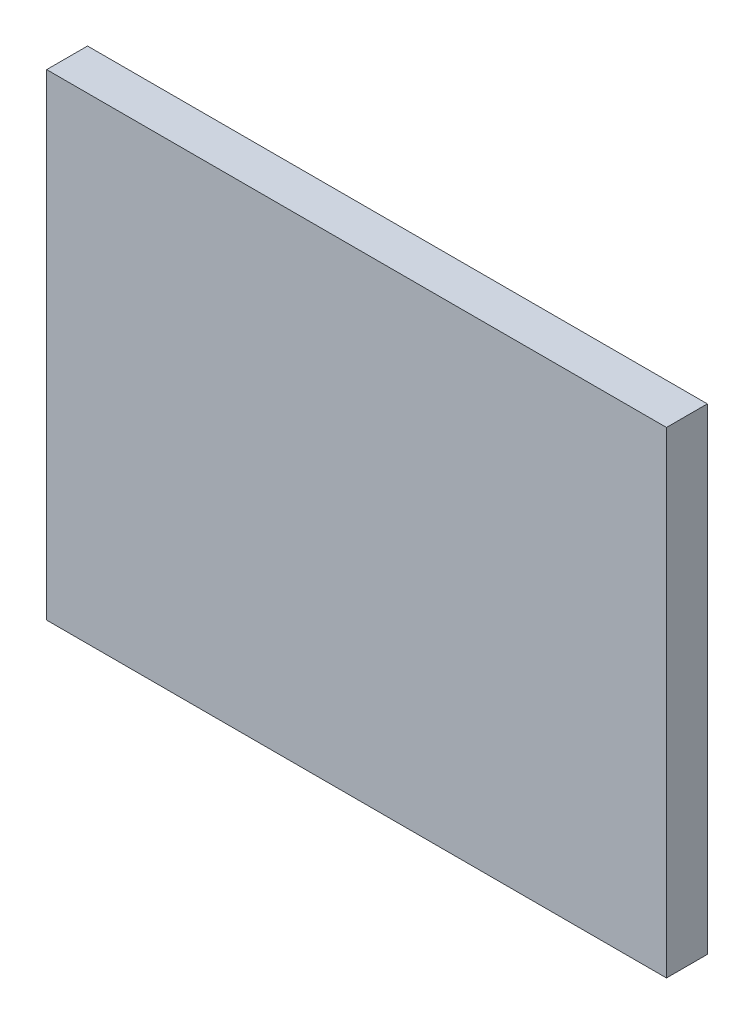
ISO-10303-21;
HEADER;
FILE_DESCRIPTION(('STEP AP214'),'2;1');
FILE_NAME('part.step','',(''),(''),'','','');
FILE_SCHEMA(('AUTOMOTIVE_DESIGN { 1 0 10303 214 1 1 1 1 }'));
ENDSEC;
DATA;
#1=APPLICATION_CONTEXT('core data for automotive mechanical design processes');
#2=APPLICATION_PROTOCOL_DEFINITION('international standard','automotive_design',2000,#1);
#3=PRODUCT_CONTEXT('',#1,'mechanical');
#4=PRODUCT('Part','Part','',(#3));
#5=PRODUCT_RELATED_PRODUCT_CATEGORY('part','',(#4));
#6=PRODUCT_DEFINITION_FORMATION('','',#4);
#7=PRODUCT_DEFINITION_CONTEXT('part definition',#1,'design');
#8=PRODUCT_DEFINITION('design','',#6,#7);
#9=PRODUCT_DEFINITION_SHAPE('','',#8);
#10=(LENGTH_UNIT() NAMED_UNIT(*) SI_UNIT(.MILLI.,.METRE.));
#11=(NAMED_UNIT(*) PLANE_ANGLE_UNIT() SI_UNIT($,.RADIAN.));
#12=(NAMED_UNIT(*) SI_UNIT($,.STERADIAN.) SOLID_ANGLE_UNIT());
#13=UNCERTAINTY_MEASURE_WITH_UNIT(LENGTH_MEASURE(1.E-05),#10,'distance_accuracy_value','');
#14=(GEOMETRIC_REPRESENTATION_CONTEXT(3) GLOBAL_UNCERTAINTY_ASSIGNED_CONTEXT((#13)) GLOBAL_UNIT_ASSIGNED_CONTEXT((#10,
#11,#12)) REPRESENTATION_CONTEXT('',''));
#15=CARTESIAN_POINT('',(0.,0.,0.));
#16=DIRECTION('',(0.,0.,1.));
#17=DIRECTION('',(1.,0.,0.));
#18=AXIS2_PLACEMENT_3D('',#15,#16,#17);
#19=CARTESIAN_POINT('',(45.4999999999999,70.,3.));
#20=DIRECTION('',(-1.,0.,0.));
#21=DIRECTION('',(0.,0.,1.));
#22=AXIS2_PLACEMENT_3D('',#19,#20,#21);
#23=PLANE('',#22);
#24=DIRECTION('',(0.,0.,-1.));
#25=VECTOR('',#24,1.);
#26=CARTESIAN_POINT('',(45.4999999999999,0.,3.));
#27=LINE('',#26,#25);
#28=CARTESIAN_POINT('',(45.4999999999999,0.,3.));
#29=VERTEX_POINT('',#28);
#30=CARTESIAN_POINT('',(45.4999999999999,0.,-3.));
#31=VERTEX_POINT('',#30);
#32=EDGE_CURVE('E96',#29,#31,#27,.T.);
#33=ORIENTED_EDGE('',*,*,#32,.T.);
#34=DIRECTION('',(0.,-1.,0.));
#35=VECTOR('',#34,1.);
#36=CARTESIAN_POINT('',(45.4999999999999,70.,-3.));
#37=LINE('',#36,#35);
#38=CARTESIAN_POINT('',(45.4999999999999,70.,-3.));
#39=VERTEX_POINT('',#38);
#40=EDGE_CURVE('E11',#39,#31,#37,.T.);
#41=ORIENTED_EDGE('',*,*,#40,.F.);
#42=DIRECTION('',(0.,0.,-1.));
#43=VECTOR('',#42,1.);
#44=CARTESIAN_POINT('',(45.4999999999999,70.,3.));
#45=LINE('',#44,#43);
#46=CARTESIAN_POINT('',(45.4999999999999,70.,3.));
#47=VERTEX_POINT('',#46);
#48=EDGE_CURVE('E84',#47,#39,#45,.T.);
#49=ORIENTED_EDGE('',*,*,#48,.F.);
#50=DIRECTION('',(0.,-1.,0.));
#51=VECTOR('',#50,1.);
#52=CARTESIAN_POINT('',(45.4999999999999,70.,3.));
#53=LINE('',#52,#51);
#54=EDGE_CURVE('E92',#47,#29,#53,.T.);
#55=ORIENTED_EDGE('',*,*,#54,.T.);
#56=EDGE_LOOP('',(#33,#41,#49,#55));
#57=FACE_BOUND('',#56,.T.);
#58=ADVANCED_FACE('F33',(#57),#23,.F.);
#59=CARTESIAN_POINT('',(-45.5000000000001,70.,-3.));
#60=DIRECTION('',(0.,0.,1.));
#61=DIRECTION('',(1.,0.,0.));
#62=AXIS2_PLACEMENT_3D('',#59,#60,#61);
#63=PLANE('',#62);
#64=DIRECTION('',(-1.,0.,0.));
#65=VECTOR('',#64,1.);
#66=CARTESIAN_POINT('',(-45.5000000000001,0.,-3.));
#67=LINE('',#66,#65);
#68=CARTESIAN_POINT('',(-45.5000000000001,0.,-3.));
#69=VERTEX_POINT('',#68);
#70=EDGE_CURVE('E88',#31,#69,#67,.T.);
#71=ORIENTED_EDGE('',*,*,#70,.T.);
#72=DIRECTION('',(0.,-1.,0.));
#73=VECTOR('',#72,1.);
#74=CARTESIAN_POINT('',(-45.5000000000001,70.,-3.));
#75=LINE('',#74,#73);
#76=CARTESIAN_POINT('',(-45.5000000000001,70.,-3.));
#77=VERTEX_POINT('',#76);
#78=EDGE_CURVE('E41',#77,#69,#75,.T.);
#79=ORIENTED_EDGE('',*,*,#78,.F.);
#80=DIRECTION('',(-1.,0.,0.));
#81=VECTOR('',#80,1.);
#82=CARTESIAN_POINT('',(-45.5000000000001,70.,-3.));
#83=LINE('',#82,#81);
#84=EDGE_CURVE('E79',#39,#77,#83,.T.);
#85=ORIENTED_EDGE('',*,*,#84,.F.);
#86=ORIENTED_EDGE('',*,*,#40,.T.);
#87=EDGE_LOOP('',(#71,#79,#85,#86));
#88=FACE_BOUND('',#87,.T.);
#89=ADVANCED_FACE('F87',(#88),#63,.F.);
#90=CARTESIAN_POINT('',(-45.5000000000001,70.,3.));
#91=DIRECTION('',(1.,0.,0.));
#92=DIRECTION('',(0.,0.,-1.));
#93=AXIS2_PLACEMENT_3D('',#90,#91,#92);
#94=PLANE('',#93);
#95=DIRECTION('',(0.,0.,1.));
#96=VECTOR('',#95,1.);
#97=CARTESIAN_POINT('',(-45.5000000000001,0.,3.));
#98=LINE('',#97,#96);
#99=CARTESIAN_POINT('',(-45.5000000000001,0.,3.));
#100=VERTEX_POINT('',#99);
#101=EDGE_CURVE('E66',#69,#100,#98,.T.);
#102=ORIENTED_EDGE('',*,*,#101,.T.);
#103=DIRECTION('',(0.,-1.,0.));
#104=VECTOR('',#103,1.);
#105=CARTESIAN_POINT('',(-45.5000000000001,70.,3.));
#106=LINE('',#105,#104);
#107=CARTESIAN_POINT('',(-45.5000000000001,70.,3.));
#108=VERTEX_POINT('',#107);
#109=EDGE_CURVE('E89',#108,#100,#106,.T.);
#110=ORIENTED_EDGE('',*,*,#109,.F.);
#111=DIRECTION('',(0.,0.,1.));
#112=VECTOR('',#111,1.);
#113=CARTESIAN_POINT('',(-45.5000000000001,70.,3.));
#114=LINE('',#113,#112);
#115=EDGE_CURVE('E82',#77,#108,#114,.T.);
#116=ORIENTED_EDGE('',*,*,#115,.F.);
#117=ORIENTED_EDGE('',*,*,#78,.T.);
#118=EDGE_LOOP('',(#102,#110,#116,#117));
#119=FACE_BOUND('',#118,.T.);
#120=ADVANCED_FACE('F90',(#119),#94,.F.);
#121=CARTESIAN_POINT('',(-45.5000000000001,70.,3.));
#122=DIRECTION('',(0.,0.,-1.));
#123=DIRECTION('',(-1.,0.,0.));
#124=AXIS2_PLACEMENT_3D('',#121,#122,#123);
#125=PLANE('',#124);
#126=DIRECTION('',(1.,0.,0.));
#127=VECTOR('',#126,1.);
#128=CARTESIAN_POINT('',(-45.5000000000001,0.,3.));
#129=LINE('',#128,#127);
#130=EDGE_CURVE('E72',#100,#29,#129,.T.);
#131=ORIENTED_EDGE('',*,*,#130,.T.);
#132=ORIENTED_EDGE('',*,*,#54,.F.);
#133=DIRECTION('',(1.,0.,0.));
#134=VECTOR('',#133,1.);
#135=CARTESIAN_POINT('',(-45.5000000000001,70.,3.));
#136=LINE('',#135,#134);
#137=EDGE_CURVE('E49',#108,#47,#136,.T.);
#138=ORIENTED_EDGE('',*,*,#137,.F.);
#139=ORIENTED_EDGE('',*,*,#109,.T.);
#140=EDGE_LOOP('',(#131,#132,#138,#139));
#141=FACE_BOUND('',#140,.T.);
#142=ADVANCED_FACE('F103',(#141),#125,.F.);
#143=CARTESIAN_POINT('',(0.,70.,0.));
#144=DIRECTION('',(0.,-1.,0.));
#145=DIRECTION('',(0.,0.,-1.));
#146=AXIS2_PLACEMENT_3D('',#143,#144,#145);
#147=PLANE('',#146);
#148=ORIENTED_EDGE('',*,*,#48,.T.);
#149=ORIENTED_EDGE('',*,*,#84,.T.);
#150=ORIENTED_EDGE('',*,*,#115,.T.);
#151=ORIENTED_EDGE('',*,*,#137,.T.);
#152=EDGE_LOOP('',(#148,#149,#150,#151));
#153=FACE_BOUND('',#152,.T.);
#154=ADVANCED_FACE('F80',(#153),#147,.F.);
#155=CARTESIAN_POINT('',(0.,0.,0.));
#156=DIRECTION('',(0.,-1.,0.));
#157=DIRECTION('',(0.,0.,-1.));
#158=AXIS2_PLACEMENT_3D('',#155,#156,#157);
#159=PLANE('',#158);
#160=ORIENTED_EDGE('',*,*,#32,.F.);
#161=ORIENTED_EDGE('',*,*,#130,.F.);
#162=ORIENTED_EDGE('',*,*,#101,.F.);
#163=ORIENTED_EDGE('',*,*,#70,.F.);
#164=EDGE_LOOP('',(#160,#161,#162,#163));
#165=FACE_BOUND('',#164,.T.);
#166=ADVANCED_FACE('F106',(#165),#159,.T.);
#167=CLOSED_SHELL('',(#58,#89,#120,#142,#154,#166));
#168=MANIFOLD_SOLID_BREP('B2',#167);
#169=ADVANCED_BREP_SHAPE_REPRESENTATION('',(#18,#168),#14);
#170=SHAPE_DEFINITION_REPRESENTATION(#9,#169);
ENDSEC;
END-ISO-10303-21;
